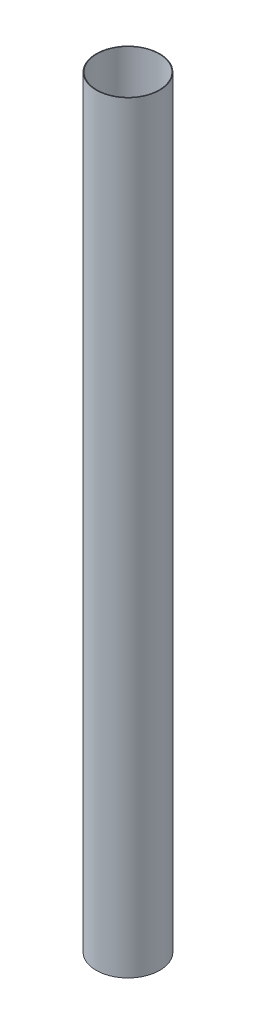
ISO-10303-21;
HEADER;
FILE_DESCRIPTION(('STEP AP214'),'2;1');
FILE_NAME('part.step','',(''),(''),'','','');
FILE_SCHEMA(('AUTOMOTIVE_DESIGN { 1 0 10303 214 1 1 1 1 }'));
ENDSEC;
DATA;
#1=APPLICATION_CONTEXT('core data for automotive mechanical design processes');
#2=APPLICATION_PROTOCOL_DEFINITION('international standard','automotive_design',2000,#1);
#3=PRODUCT_CONTEXT('',#1,'mechanical');
#4=PRODUCT('Part','Part','',(#3));
#5=PRODUCT_RELATED_PRODUCT_CATEGORY('part','',(#4));
#6=PRODUCT_DEFINITION_FORMATION('','',#4);
#7=PRODUCT_DEFINITION_CONTEXT('part definition',#1,'design');
#8=PRODUCT_DEFINITION('design','',#6,#7);
#9=PRODUCT_DEFINITION_SHAPE('','',#8);
#10=(LENGTH_UNIT() NAMED_UNIT(*) SI_UNIT(.MILLI.,.METRE.));
#11=(NAMED_UNIT(*) PLANE_ANGLE_UNIT() SI_UNIT($,.RADIAN.));
#12=(NAMED_UNIT(*) SI_UNIT($,.STERADIAN.) SOLID_ANGLE_UNIT());
#13=UNCERTAINTY_MEASURE_WITH_UNIT(LENGTH_MEASURE(1.E-05),#10,'distance_accuracy_value','');
#14=(GEOMETRIC_REPRESENTATION_CONTEXT(3) GLOBAL_UNCERTAINTY_ASSIGNED_CONTEXT((#13)) GLOBAL_UNIT_ASSIGNED_CONTEXT((#10,
#11,#12)) REPRESENTATION_CONTEXT('',''));
#15=CARTESIAN_POINT('',(0.,0.,0.));
#16=DIRECTION('',(0.,0.,1.));
#17=DIRECTION('',(1.,0.,0.));
#18=AXIS2_PLACEMENT_3D('',#15,#16,#17);
#19=CARTESIAN_POINT('',(0.,1200.,0.));
#20=DIRECTION('',(0.,1.,0.));
#21=DIRECTION('',(0.,0.,1.));
#22=AXIS2_PLACEMENT_3D('',#19,#20,#21);
#23=PLANE('',#22);
#24=CARTESIAN_POINT('',(0.,1200.,0.));
#25=DIRECTION('',(0.,1.,0.));
#26=DIRECTION('',(0.,0.,1.));
#27=AXIS2_PLACEMENT_3D('',#24,#25,#26);
#28=CIRCLE('',#27,50.);
#29=CARTESIAN_POINT('',(0.,1200.,50.));
#30=VERTEX_POINT('',#29);
#31=EDGE_CURVE('E10',#30,#30,#28,.T.);
#32=ORIENTED_EDGE('',*,*,#31,.T.);
#33=EDGE_LOOP('',(#32));
#34=FACE_BOUND('',#33,.T.);
#35=CARTESIAN_POINT('',(0.,1200.,0.));
#36=DIRECTION('',(0.,1.,0.));
#37=DIRECTION('',(0.,0.,1.));
#38=AXIS2_PLACEMENT_3D('',#35,#36,#37);
#39=CIRCLE('',#38,49.);
#40=CARTESIAN_POINT('',(0.,1200.,49.));
#41=VERTEX_POINT('',#40);
#42=EDGE_CURVE('E45',#41,#41,#39,.T.);
#43=ORIENTED_EDGE('',*,*,#42,.F.);
#44=EDGE_LOOP('',(#43));
#45=FACE_BOUND('',#44,.T.);
#46=ADVANCED_FACE('F34',(#34,#45),#23,.T.);
#47=CARTESIAN_POINT('',(0.,0.,0.));
#48=DIRECTION('',(0.,1.,0.));
#49=DIRECTION('',(0.,0.,1.));
#50=AXIS2_PLACEMENT_3D('',#47,#48,#49);
#51=PLANE('',#50);
#52=CARTESIAN_POINT('',(0.,0.,0.));
#53=DIRECTION('',(0.,1.,0.));
#54=DIRECTION('',(0.,0.,1.));
#55=AXIS2_PLACEMENT_3D('',#52,#53,#54);
#56=CIRCLE('',#55,50.);
#57=CARTESIAN_POINT('',(0.,0.,50.));
#58=VERTEX_POINT('',#57);
#59=EDGE_CURVE('E38',#58,#58,#56,.T.);
#60=ORIENTED_EDGE('',*,*,#59,.F.);
#61=EDGE_LOOP('',(#60));
#62=FACE_BOUND('',#61,.T.);
#63=CARTESIAN_POINT('',(0.,0.,0.));
#64=DIRECTION('',(0.,1.,0.));
#65=DIRECTION('',(0.,0.,1.));
#66=AXIS2_PLACEMENT_3D('',#63,#64,#65);
#67=CIRCLE('',#66,49.);
#68=CARTESIAN_POINT('',(0.,0.,49.));
#69=VERTEX_POINT('',#68);
#70=EDGE_CURVE('E47',#69,#69,#67,.T.);
#71=ORIENTED_EDGE('',*,*,#70,.T.);
#72=EDGE_LOOP('',(#71));
#73=FACE_BOUND('',#72,.T.);
#74=ADVANCED_FACE('F57',(#62,#73),#51,.F.);
#75=CARTESIAN_POINT('',(0.,1200.,0.));
#76=DIRECTION('',(0.,-1.,0.));
#77=DIRECTION('',(0.,0.,-1.));
#78=AXIS2_PLACEMENT_3D('',#75,#76,#77);
#79=CYLINDRICAL_SURFACE('',#78,50.);
#80=ORIENTED_EDGE('',*,*,#31,.F.);
#81=EDGE_LOOP('',(#80));
#82=FACE_BOUND('',#81,.T.);
#83=ORIENTED_EDGE('',*,*,#59,.T.);
#84=EDGE_LOOP('',(#83));
#85=FACE_BOUND('',#84,.T.);
#86=ADVANCED_FACE('F36',(#82,#85),#79,.T.);
#87=CARTESIAN_POINT('',(0.,1200.,0.));
#88=DIRECTION('',(0.,-1.,0.));
#89=DIRECTION('',(0.,0.,-1.));
#90=AXIS2_PLACEMENT_3D('',#87,#88,#89);
#91=CYLINDRICAL_SURFACE('',#90,49.);
#92=ORIENTED_EDGE('',*,*,#42,.T.);
#93=EDGE_LOOP('',(#92));
#94=FACE_BOUND('',#93,.T.);
#95=ORIENTED_EDGE('',*,*,#70,.F.);
#96=EDGE_LOOP('',(#95));
#97=FACE_BOUND('',#96,.T.);
#98=ADVANCED_FACE('F53',(#94,#97),#91,.F.);
#99=CLOSED_SHELL('',(#46,#74,#86,#98));
#100=MANIFOLD_SOLID_BREP('B2',#99);
#101=ADVANCED_BREP_SHAPE_REPRESENTATION('',(#18,#100),#14);
#102=SHAPE_DEFINITION_REPRESENTATION(#9,#101);
ENDSEC;
END-ISO-10303-21;
